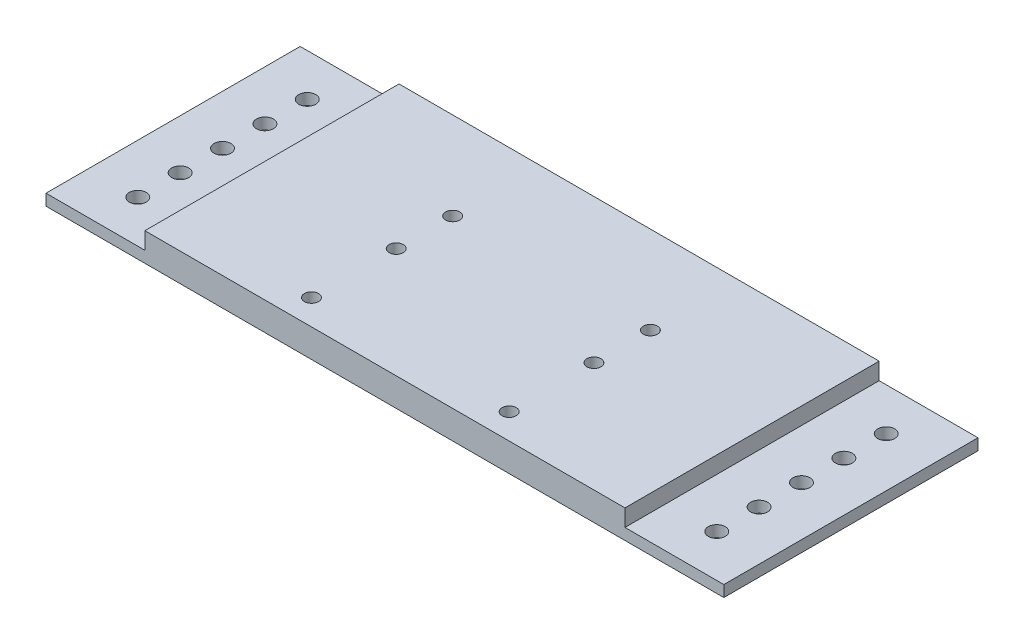
ISO-10303-21;
HEADER;
FILE_DESCRIPTION(('STEP AP214'),'2;1');
FILE_NAME('part.step','',(''),(''),'','','');
FILE_SCHEMA(('AUTOMOTIVE_DESIGN { 1 0 10303 214 1 1 1 1 }'));
ENDSEC;
DATA;
#1=APPLICATION_CONTEXT('core data for automotive mechanical design processes');
#2=APPLICATION_PROTOCOL_DEFINITION('international standard','automotive_design',2000,#1);
#3=PRODUCT_CONTEXT('',#1,'mechanical');
#4=PRODUCT('Part','Part','',(#3));
#5=PRODUCT_RELATED_PRODUCT_CATEGORY('part','',(#4));
#6=PRODUCT_DEFINITION_FORMATION('','',#4);
#7=PRODUCT_DEFINITION_CONTEXT('part definition',#1,'design');
#8=PRODUCT_DEFINITION('design','',#6,#7);
#9=PRODUCT_DEFINITION_SHAPE('','',#8);
#10=(LENGTH_UNIT() NAMED_UNIT(*) SI_UNIT(.MILLI.,.METRE.));
#11=(NAMED_UNIT(*) PLANE_ANGLE_UNIT() SI_UNIT($,.RADIAN.));
#12=(NAMED_UNIT(*) SI_UNIT($,.STERADIAN.) SOLID_ANGLE_UNIT());
#13=UNCERTAINTY_MEASURE_WITH_UNIT(LENGTH_MEASURE(1.E-05),#10,'distance_accuracy_value','');
#14=(GEOMETRIC_REPRESENTATION_CONTEXT(3) GLOBAL_UNCERTAINTY_ASSIGNED_CONTEXT((#13)) GLOBAL_UNIT_ASSIGNED_CONTEXT((#10,
#11,#12)) REPRESENTATION_CONTEXT('',''));
#15=CARTESIAN_POINT('',(0.,0.,0.));
#16=DIRECTION('',(0.,0.,1.));
#17=DIRECTION('',(1.,0.,0.));
#18=AXIS2_PLACEMENT_3D('',#15,#16,#17);
#19=CARTESIAN_POINT('',(0.,4.,0.));
#20=DIRECTION('',(0.,1.,0.));
#21=DIRECTION('',(0.,0.,1.));
#22=AXIS2_PLACEMENT_3D('',#19,#20,#21);
#23=PLANE('',#22);
#24=CARTESIAN_POINT('',(222.5,4.,14.9999999999999));
#25=DIRECTION('',(0.,1.,0.));
#26=DIRECTION('',(0.,0.,-1.));
#27=AXIS2_PLACEMENT_3D('',#24,#25,#26);
#28=CIRCLE('',#27,3.00000000000002);
#29=CARTESIAN_POINT('',(222.5,4.,11.9999999999999));
#30=VERTEX_POINT('',#29);
#31=EDGE_CURVE('E235',#30,#30,#28,.T.);
#32=ORIENTED_EDGE('',*,*,#31,.F.);
#33=EDGE_LOOP('',(#32));
#34=FACE_BOUND('',#33,.T.);
#35=CARTESIAN_POINT('',(222.5,4.,29.9999999999999));
#36=DIRECTION('',(0.,1.,0.));
#37=DIRECTION('',(0.,0.,-1.));
#38=AXIS2_PLACEMENT_3D('',#35,#36,#37);
#39=CIRCLE('',#38,3.00000000000002);
#40=CARTESIAN_POINT('',(222.5,4.,26.9999999999999));
#41=VERTEX_POINT('',#40);
#42=EDGE_CURVE('E242',#41,#41,#39,.T.);
#43=ORIENTED_EDGE('',*,*,#42,.F.);
#44=EDGE_LOOP('',(#43));
#45=FACE_BOUND('',#44,.T.);
#46=CARTESIAN_POINT('',(222.5,4.,44.9999999999999));
#47=DIRECTION('',(0.,1.,0.));
#48=DIRECTION('',(0.,0.,-1.));
#49=AXIS2_PLACEMENT_3D('',#46,#47,#48);
#50=CIRCLE('',#49,2.99999999999999);
#51=CARTESIAN_POINT('',(222.5,4.,41.9999999999999));
#52=VERTEX_POINT('',#51);
#53=EDGE_CURVE('E248',#52,#52,#50,.T.);
#54=ORIENTED_EDGE('',*,*,#53,.F.);
#55=EDGE_LOOP('',(#54));
#56=FACE_BOUND('',#55,.T.);
#57=CARTESIAN_POINT('',(222.5,4.,59.9999999999999));
#58=DIRECTION('',(0.,1.,0.));
#59=DIRECTION('',(0.,0.,-1.));
#60=AXIS2_PLACEMENT_3D('',#57,#58,#59);
#61=CIRCLE('',#60,2.99999999999999);
#62=CARTESIAN_POINT('',(222.5,4.,56.9999999999999));
#63=VERTEX_POINT('',#62);
#64=EDGE_CURVE('E254',#63,#63,#61,.T.);
#65=ORIENTED_EDGE('',*,*,#64,.F.);
#66=EDGE_LOOP('',(#65));
#67=FACE_BOUND('',#66,.T.);
#68=CARTESIAN_POINT('',(222.5,4.,74.9999999999999));
#69=DIRECTION('',(0.,1.,0.));
#70=DIRECTION('',(0.,0.,-1.));
#71=AXIS2_PLACEMENT_3D('',#68,#69,#70);
#72=CIRCLE('',#71,2.99999999999999);
#73=CARTESIAN_POINT('',(222.5,4.,71.9999999999999));
#74=VERTEX_POINT('',#73);
#75=EDGE_CURVE('E260',#74,#74,#72,.T.);
#76=ORIENTED_EDGE('',*,*,#75,.F.);
#77=EDGE_LOOP('',(#76));
#78=FACE_BOUND('',#77,.T.);
#79=DIRECTION('',(0.,0.,-1.));
#80=VECTOR('',#79,1.);
#81=CARTESIAN_POINT('',(205.,4.,0.));
#82=LINE('',#81,#80);
#83=CARTESIAN_POINT('',(205.,4.,90.));
#84=VERTEX_POINT('',#83);
#85=CARTESIAN_POINT('',(205.,4.,0.));
#86=VERTEX_POINT('',#85);
#87=EDGE_CURVE('E126',#84,#86,#82,.T.);
#88=ORIENTED_EDGE('',*,*,#87,.F.);
#89=DIRECTION('',(1.,0.,0.));
#90=VECTOR('',#89,1.);
#91=CARTESIAN_POINT('',(0.,4.,90.));
#92=LINE('',#91,#90);
#93=CARTESIAN_POINT('',(240.,4.,90.));
#94=VERTEX_POINT('',#93);
#95=EDGE_CURVE('E139',#84,#94,#92,.T.);
#96=ORIENTED_EDGE('',*,*,#95,.T.);
#97=DIRECTION('',(0.,0.,-1.));
#98=VECTOR('',#97,1.);
#99=CARTESIAN_POINT('',(240.,4.,0.));
#100=LINE('',#99,#98);
#101=CARTESIAN_POINT('',(240.,4.,0.));
#102=VERTEX_POINT('',#101);
#103=EDGE_CURVE('E143',#94,#102,#100,.T.);
#104=ORIENTED_EDGE('',*,*,#103,.T.);
#105=DIRECTION('',(-1.,0.,0.));
#106=VECTOR('',#105,1.);
#107=CARTESIAN_POINT('',(0.,4.,0.));
#108=LINE('',#107,#106);
#109=EDGE_CURVE('E63',#102,#86,#108,.T.);
#110=ORIENTED_EDGE('',*,*,#109,.T.);
#111=EDGE_LOOP('',(#88,#96,#104,#110));
#112=FACE_BOUND('',#111,.T.);
#113=ADVANCED_FACE('F40',(#34,#45,#56,#67,#78,#112),#23,.T.);
#114=CARTESIAN_POINT('',(0.,4.,0.));
#115=DIRECTION('',(1.,0.,0.));
#116=DIRECTION('',(0.,0.,-1.));
#117=AXIS2_PLACEMENT_3D('',#114,#115,#116);
#118=PLANE('',#117);
#119=DIRECTION('',(0.,0.,1.));
#120=VECTOR('',#119,1.);
#121=CARTESIAN_POINT('',(0.,0.,0.));
#122=LINE('',#121,#120);
#123=CARTESIAN_POINT('',(0.,0.,0.));
#124=VERTEX_POINT('',#123);
#125=CARTESIAN_POINT('',(0.,0.,90.));
#126=VERTEX_POINT('',#125);
#127=EDGE_CURVE('E127',#124,#126,#122,.T.);
#128=ORIENTED_EDGE('',*,*,#127,.T.);
#129=DIRECTION('',(0.,-1.,0.));
#130=VECTOR('',#129,1.);
#131=CARTESIAN_POINT('',(0.,4.,90.));
#132=LINE('',#131,#130);
#133=CARTESIAN_POINT('',(0.,4.,90.));
#134=VERTEX_POINT('',#133);
#135=EDGE_CURVE('E11',#134,#126,#132,.T.);
#136=ORIENTED_EDGE('',*,*,#135,.F.);
#137=DIRECTION('',(0.,0.,1.));
#138=VECTOR('',#137,1.);
#139=CARTESIAN_POINT('',(0.,4.,0.));
#140=LINE('',#139,#138);
#141=CARTESIAN_POINT('',(0.,4.,0.));
#142=VERTEX_POINT('',#141);
#143=EDGE_CURVE('E136',#142,#134,#140,.T.);
#144=ORIENTED_EDGE('',*,*,#143,.F.);
#145=DIRECTION('',(0.,-1.,0.));
#146=VECTOR('',#145,1.);
#147=CARTESIAN_POINT('',(0.,4.,0.));
#148=LINE('',#147,#146);
#149=EDGE_CURVE('E146',#142,#124,#148,.T.);
#150=ORIENTED_EDGE('',*,*,#149,.T.);
#151=EDGE_LOOP('',(#128,#136,#144,#150));
#152=FACE_BOUND('',#151,.T.);
#153=ADVANCED_FACE('F42',(#152),#118,.F.);
#154=CARTESIAN_POINT('',(0.,4.,90.));
#155=DIRECTION('',(0.,0.,-1.));
#156=DIRECTION('',(-1.,0.,0.));
#157=AXIS2_PLACEMENT_3D('',#154,#155,#156);
#158=PLANE('',#157);
#159=DIRECTION('',(1.,0.,0.));
#160=VECTOR('',#159,1.);
#161=CARTESIAN_POINT('',(0.,0.,90.));
#162=LINE('',#161,#160);
#163=CARTESIAN_POINT('',(240.,0.,90.));
#164=VERTEX_POINT('',#163);
#165=EDGE_CURVE('E130',#126,#164,#162,.T.);
#166=ORIENTED_EDGE('',*,*,#165,.T.);
#167=DIRECTION('',(0.,-1.,0.));
#168=VECTOR('',#167,1.);
#169=CARTESIAN_POINT('',(240.,4.,90.));
#170=LINE('',#169,#168);
#171=EDGE_CURVE('E48',#94,#164,#170,.T.);
#172=ORIENTED_EDGE('',*,*,#171,.F.);
#173=ORIENTED_EDGE('',*,*,#95,.F.);
#174=DIRECTION('',(0.,-1.,0.));
#175=VECTOR('',#174,1.);
#176=CARTESIAN_POINT('',(205.,10.,90.));
#177=LINE('',#176,#175);
#178=CARTESIAN_POINT('',(205.,10.,90.));
#179=VERTEX_POINT('',#178);
#180=EDGE_CURVE('E179',#179,#84,#177,.T.);
#181=ORIENTED_EDGE('',*,*,#180,.F.);
#182=DIRECTION('',(1.,0.,0.));
#183=VECTOR('',#182,1.);
#184=CARTESIAN_POINT('',(35.,10.,90.));
#185=LINE('',#184,#183);
#186=CARTESIAN_POINT('',(35.,10.,90.));
#187=VERTEX_POINT('',#186);
#188=EDGE_CURVE('E120',#187,#179,#185,.T.);
#189=ORIENTED_EDGE('',*,*,#188,.F.);
#190=DIRECTION('',(0.,-1.,0.));
#191=VECTOR('',#190,1.);
#192=CARTESIAN_POINT('',(35.,10.,90.));
#193=LINE('',#192,#191);
#194=CARTESIAN_POINT('',(35.,4.,90.));
#195=VERTEX_POINT('',#194);
#196=EDGE_CURVE('E132',#187,#195,#193,.T.);
#197=ORIENTED_EDGE('',*,*,#196,.T.);
#198=EDGE_CURVE('E141',#134,#195,#92,.T.);
#199=ORIENTED_EDGE('',*,*,#198,.F.);
#200=ORIENTED_EDGE('',*,*,#135,.T.);
#201=EDGE_LOOP('',(#166,#172,#173,#181,#189,#197,#199,#200));
#202=FACE_BOUND('',#201,.T.);
#203=ADVANCED_FACE('F185',(#202),#158,.F.);
#204=CARTESIAN_POINT('',(240.,4.,0.));
#205=DIRECTION('',(-1.,0.,0.));
#206=DIRECTION('',(0.,0.,1.));
#207=AXIS2_PLACEMENT_3D('',#204,#205,#206);
#208=PLANE('',#207);
#209=DIRECTION('',(0.,0.,-1.));
#210=VECTOR('',#209,1.);
#211=CARTESIAN_POINT('',(240.,0.,0.));
#212=LINE('',#211,#210);
#213=CARTESIAN_POINT('',(240.,0.,0.));
#214=VERTEX_POINT('',#213);
#215=EDGE_CURVE('E149',#164,#214,#212,.T.);
#216=ORIENTED_EDGE('',*,*,#215,.T.);
#217=DIRECTION('',(0.,-1.,0.));
#218=VECTOR('',#217,1.);
#219=CARTESIAN_POINT('',(240.,4.,0.));
#220=LINE('',#219,#218);
#221=EDGE_CURVE('E154',#102,#214,#220,.T.);
#222=ORIENTED_EDGE('',*,*,#221,.F.);
#223=ORIENTED_EDGE('',*,*,#103,.F.);
#224=ORIENTED_EDGE('',*,*,#171,.T.);
#225=EDGE_LOOP('',(#216,#222,#223,#224));
#226=FACE_BOUND('',#225,.T.);
#227=ADVANCED_FACE('F161',(#226),#208,.F.);
#228=CARTESIAN_POINT('',(0.,4.,0.));
#229=DIRECTION('',(0.,0.,1.));
#230=DIRECTION('',(1.,0.,0.));
#231=AXIS2_PLACEMENT_3D('',#228,#229,#230);
#232=PLANE('',#231);
#233=DIRECTION('',(-1.,0.,0.));
#234=VECTOR('',#233,1.);
#235=CARTESIAN_POINT('',(0.,0.,0.));
#236=LINE('',#235,#234);
#237=EDGE_CURVE('E140',#214,#124,#236,.T.);
#238=ORIENTED_EDGE('',*,*,#237,.T.);
#239=ORIENTED_EDGE('',*,*,#149,.F.);
#240=CARTESIAN_POINT('',(35.,4.,0.));
#241=VERTEX_POINT('',#240);
#242=EDGE_CURVE('E145',#241,#142,#108,.T.);
#243=ORIENTED_EDGE('',*,*,#242,.F.);
#244=DIRECTION('',(0.,-1.,0.));
#245=VECTOR('',#244,1.);
#246=CARTESIAN_POINT('',(35.,10.,0.));
#247=LINE('',#246,#245);
#248=CARTESIAN_POINT('',(35.,10.,0.));
#249=VERTEX_POINT('',#248);
#250=EDGE_CURVE('E111',#249,#241,#247,.T.);
#251=ORIENTED_EDGE('',*,*,#250,.F.);
#252=DIRECTION('',(-1.,0.,0.));
#253=VECTOR('',#252,1.);
#254=CARTESIAN_POINT('',(35.,10.,0.));
#255=LINE('',#254,#253);
#256=CARTESIAN_POINT('',(205.,10.,0.));
#257=VERTEX_POINT('',#256);
#258=EDGE_CURVE('E104',#257,#249,#255,.T.);
#259=ORIENTED_EDGE('',*,*,#258,.F.);
#260=DIRECTION('',(0.,-1.,0.));
#261=VECTOR('',#260,1.);
#262=CARTESIAN_POINT('',(205.,10.,0.));
#263=LINE('',#262,#261);
#264=EDGE_CURVE('E108',#257,#86,#263,.T.);
#265=ORIENTED_EDGE('',*,*,#264,.T.);
#266=ORIENTED_EDGE('',*,*,#109,.F.);
#267=ORIENTED_EDGE('',*,*,#221,.T.);
#268=EDGE_LOOP('',(#238,#239,#243,#251,#259,#265,#266,#267));
#269=FACE_BOUND('',#268,.T.);
#270=ADVANCED_FACE('F106',(#269),#232,.F.);
#271=CARTESIAN_POINT('',(17.5,4.,75.));
#272=DIRECTION('',(0.,1.,0.));
#273=DIRECTION('',(0.,0.,1.));
#274=AXIS2_PLACEMENT_3D('',#271,#272,#273);
#275=CIRCLE('',#274,3.);
#276=CARTESIAN_POINT('',(17.5,4.,78.));
#277=VERTEX_POINT('',#276);
#278=EDGE_CURVE('E209',#277,#277,#275,.T.);
#279=ORIENTED_EDGE('',*,*,#278,.F.);
#280=EDGE_LOOP('',(#279));
#281=FACE_BOUND('',#280,.T.);
#282=CARTESIAN_POINT('',(17.5,4.,60.));
#283=DIRECTION('',(0.,1.,0.));
#284=DIRECTION('',(0.,0.,1.));
#285=AXIS2_PLACEMENT_3D('',#282,#283,#284);
#286=CIRCLE('',#285,3.);
#287=CARTESIAN_POINT('',(17.5,4.,63.));
#288=VERTEX_POINT('',#287);
#289=EDGE_CURVE('E213',#288,#288,#286,.T.);
#290=ORIENTED_EDGE('',*,*,#289,.F.);
#291=EDGE_LOOP('',(#290));
#292=FACE_BOUND('',#291,.T.);
#293=CARTESIAN_POINT('',(17.5,4.,45.));
#294=DIRECTION('',(0.,1.,0.));
#295=DIRECTION('',(0.,0.,1.));
#296=AXIS2_PLACEMENT_3D('',#293,#294,#295);
#297=CIRCLE('',#296,3.);
#298=CARTESIAN_POINT('',(17.5,4.,48.));
#299=VERTEX_POINT('',#298);
#300=EDGE_CURVE('E217',#299,#299,#297,.T.);
#301=ORIENTED_EDGE('',*,*,#300,.F.);
#302=EDGE_LOOP('',(#301));
#303=FACE_BOUND('',#302,.T.);
#304=CARTESIAN_POINT('',(17.5,4.,30.));
#305=DIRECTION('',(0.,1.,0.));
#306=DIRECTION('',(0.,0.,1.));
#307=AXIS2_PLACEMENT_3D('',#304,#305,#306);
#308=CIRCLE('',#307,3.);
#309=CARTESIAN_POINT('',(17.5,4.,33.));
#310=VERTEX_POINT('',#309);
#311=EDGE_CURVE('E221',#310,#310,#308,.T.);
#312=ORIENTED_EDGE('',*,*,#311,.F.);
#313=EDGE_LOOP('',(#312));
#314=FACE_BOUND('',#313,.T.);
#315=CARTESIAN_POINT('',(17.5,4.,15.));
#316=DIRECTION('',(0.,1.,0.));
#317=DIRECTION('',(0.,0.,1.));
#318=AXIS2_PLACEMENT_3D('',#315,#316,#317);
#319=CIRCLE('',#318,3.);
#320=CARTESIAN_POINT('',(17.5,4.,18.));
#321=VERTEX_POINT('',#320);
#322=EDGE_CURVE('E224',#321,#321,#319,.T.);
#323=ORIENTED_EDGE('',*,*,#322,.F.);
#324=EDGE_LOOP('',(#323));
#325=FACE_BOUND('',#324,.T.);
#326=DIRECTION('',(0.,0.,1.));
#327=VECTOR('',#326,1.);
#328=CARTESIAN_POINT('',(35.,4.,0.));
#329=LINE('',#328,#327);
#330=EDGE_CURVE('E55',#241,#195,#329,.T.);
#331=ORIENTED_EDGE('',*,*,#330,.F.);
#332=ORIENTED_EDGE('',*,*,#242,.T.);
#333=ORIENTED_EDGE('',*,*,#143,.T.);
#334=ORIENTED_EDGE('',*,*,#198,.T.);
#335=EDGE_LOOP('',(#331,#332,#333,#334));
#336=FACE_BOUND('',#335,.T.);
#337=ADVANCED_FACE('F173',(#281,#292,#303,#314,#325,#336),#23,.T.);
#338=CARTESIAN_POINT('',(0.,0.,0.));
#339=DIRECTION('',(0.,1.,0.));
#340=DIRECTION('',(0.,0.,1.));
#341=AXIS2_PLACEMENT_3D('',#338,#339,#340);
#342=PLANE('',#341);
#343=CARTESIAN_POINT('',(85.,0.,51.));
#344=DIRECTION('',(0.,-1.,0.));
#345=DIRECTION('',(0.,0.,-1.));
#346=AXIS2_PLACEMENT_3D('',#343,#344,#345);
#347=CIRCLE('',#346,2.5);
#348=CARTESIAN_POINT('',(85.,0.,48.5));
#349=VERTEX_POINT('',#348);
#350=EDGE_CURVE('E298',#349,#349,#347,.T.);
#351=ORIENTED_EDGE('',*,*,#350,.F.);
#352=EDGE_LOOP('',(#351));
#353=FACE_BOUND('',#352,.T.);
#354=CARTESIAN_POINT('',(155.,0.,31.));
#355=DIRECTION('',(0.,-1.,0.));
#356=DIRECTION('',(0.,0.,-1.));
#357=AXIS2_PLACEMENT_3D('',#354,#355,#356);
#358=CIRCLE('',#357,2.5);
#359=CARTESIAN_POINT('',(155.,0.,28.5));
#360=VERTEX_POINT('',#359);
#361=EDGE_CURVE('E287',#360,#360,#358,.T.);
#362=ORIENTED_EDGE('',*,*,#361,.F.);
#363=EDGE_LOOP('',(#362));
#364=FACE_BOUND('',#363,.T.);
#365=CARTESIAN_POINT('',(85.,0.,31.));
#366=DIRECTION('',(0.,-1.,0.));
#367=DIRECTION('',(0.,0.,-1.));
#368=AXIS2_PLACEMENT_3D('',#365,#366,#367);
#369=CIRCLE('',#368,2.49999999999999);
#370=CARTESIAN_POINT('',(85.,0.,28.5));
#371=VERTEX_POINT('',#370);
#372=EDGE_CURVE('E286',#371,#371,#369,.T.);
#373=ORIENTED_EDGE('',*,*,#372,.F.);
#374=EDGE_LOOP('',(#373));
#375=FACE_BOUND('',#374,.T.);
#376=CARTESIAN_POINT('',(155.,0.,81.));
#377=DIRECTION('',(0.,-1.,0.));
#378=DIRECTION('',(0.,0.,-1.));
#379=AXIS2_PLACEMENT_3D('',#376,#377,#378);
#380=CIRCLE('',#379,2.5);
#381=CARTESIAN_POINT('',(155.,0.,78.5));
#382=VERTEX_POINT('',#381);
#383=EDGE_CURVE('E280',#382,#382,#380,.T.);
#384=ORIENTED_EDGE('',*,*,#383,.F.);
#385=EDGE_LOOP('',(#384));
#386=FACE_BOUND('',#385,.T.);
#387=CARTESIAN_POINT('',(155.,0.,51.));
#388=DIRECTION('',(0.,-1.,0.));
#389=DIRECTION('',(0.,0.,-1.));
#390=AXIS2_PLACEMENT_3D('',#387,#388,#389);
#391=CIRCLE('',#390,2.5);
#392=CARTESIAN_POINT('',(155.,0.,48.5));
#393=VERTEX_POINT('',#392);
#394=EDGE_CURVE('E299',#393,#393,#391,.T.);
#395=ORIENTED_EDGE('',*,*,#394,.F.);
#396=EDGE_LOOP('',(#395));
#397=FACE_BOUND('',#396,.T.);
#398=CARTESIAN_POINT('',(85.,0.,81.));
#399=DIRECTION('',(0.,-1.,0.));
#400=DIRECTION('',(0.,0.,-1.));
#401=AXIS2_PLACEMENT_3D('',#398,#399,#400);
#402=CIRCLE('',#401,2.5);
#403=CARTESIAN_POINT('',(85.,0.,78.5));
#404=VERTEX_POINT('',#403);
#405=EDGE_CURVE('E277',#404,#404,#402,.T.);
#406=ORIENTED_EDGE('',*,*,#405,.F.);
#407=EDGE_LOOP('',(#406));
#408=FACE_BOUND('',#407,.T.);
#409=CARTESIAN_POINT('',(222.5,0.,14.9999999999999));
#410=DIRECTION('',(0.,1.,0.));
#411=DIRECTION('',(0.,0.,-1.));
#412=AXIS2_PLACEMENT_3D('',#409,#410,#411);
#413=CIRCLE('',#412,3.00000000000002);
#414=CARTESIAN_POINT('',(222.5,0.,11.9999999999999));
#415=VERTEX_POINT('',#414);
#416=EDGE_CURVE('E232',#415,#415,#413,.T.);
#417=ORIENTED_EDGE('',*,*,#416,.T.);
#418=EDGE_LOOP('',(#417));
#419=FACE_BOUND('',#418,.T.);
#420=CARTESIAN_POINT('',(222.5,0.,29.9999999999999));
#421=DIRECTION('',(0.,1.,0.));
#422=DIRECTION('',(0.,0.,-1.));
#423=AXIS2_PLACEMENT_3D('',#420,#421,#422);
#424=CIRCLE('',#423,3.00000000000002);
#425=CARTESIAN_POINT('',(222.5,0.,26.9999999999999));
#426=VERTEX_POINT('',#425);
#427=EDGE_CURVE('E239',#426,#426,#424,.T.);
#428=ORIENTED_EDGE('',*,*,#427,.T.);
#429=EDGE_LOOP('',(#428));
#430=FACE_BOUND('',#429,.T.);
#431=CARTESIAN_POINT('',(222.5,0.,44.9999999999999));
#432=DIRECTION('',(0.,1.,0.));
#433=DIRECTION('',(0.,0.,-1.));
#434=AXIS2_PLACEMENT_3D('',#431,#432,#433);
#435=CIRCLE('',#434,2.99999999999999);
#436=CARTESIAN_POINT('',(222.5,0.,41.9999999999999));
#437=VERTEX_POINT('',#436);
#438=EDGE_CURVE('E245',#437,#437,#435,.T.);
#439=ORIENTED_EDGE('',*,*,#438,.T.);
#440=EDGE_LOOP('',(#439));
#441=FACE_BOUND('',#440,.T.);
#442=CARTESIAN_POINT('',(222.5,0.,59.9999999999999));
#443=DIRECTION('',(0.,1.,0.));
#444=DIRECTION('',(0.,0.,-1.));
#445=AXIS2_PLACEMENT_3D('',#442,#443,#444);
#446=CIRCLE('',#445,2.99999999999999);
#447=CARTESIAN_POINT('',(222.5,0.,56.9999999999999));
#448=VERTEX_POINT('',#447);
#449=EDGE_CURVE('E251',#448,#448,#446,.T.);
#450=ORIENTED_EDGE('',*,*,#449,.T.);
#451=EDGE_LOOP('',(#450));
#452=FACE_BOUND('',#451,.T.);
#453=CARTESIAN_POINT('',(222.5,0.,74.9999999999999));
#454=DIRECTION('',(0.,1.,0.));
#455=DIRECTION('',(0.,0.,-1.));
#456=AXIS2_PLACEMENT_3D('',#453,#454,#455);
#457=CIRCLE('',#456,2.99999999999999);
#458=CARTESIAN_POINT('',(222.5,0.,71.9999999999999));
#459=VERTEX_POINT('',#458);
#460=EDGE_CURVE('E257',#459,#459,#457,.T.);
#461=ORIENTED_EDGE('',*,*,#460,.T.);
#462=EDGE_LOOP('',(#461));
#463=FACE_BOUND('',#462,.T.);
#464=CARTESIAN_POINT('',(17.5,0.,75.));
#465=DIRECTION('',(0.,1.,0.));
#466=DIRECTION('',(0.,0.,1.));
#467=AXIS2_PLACEMENT_3D('',#464,#465,#466);
#468=CIRCLE('',#467,3.);
#469=CARTESIAN_POINT('',(17.5,0.,78.));
#470=VERTEX_POINT('',#469);
#471=EDGE_CURVE('E263',#470,#470,#468,.T.);
#472=ORIENTED_EDGE('',*,*,#471,.T.);
#473=EDGE_LOOP('',(#472));
#474=FACE_BOUND('',#473,.T.);
#475=CARTESIAN_POINT('',(17.5,0.,60.));
#476=DIRECTION('',(0.,1.,0.));
#477=DIRECTION('',(0.,0.,1.));
#478=AXIS2_PLACEMENT_3D('',#475,#476,#477);
#479=CIRCLE('',#478,3.);
#480=CARTESIAN_POINT('',(17.5,0.,63.));
#481=VERTEX_POINT('',#480);
#482=EDGE_CURVE('E267',#481,#481,#479,.T.);
#483=ORIENTED_EDGE('',*,*,#482,.T.);
#484=EDGE_LOOP('',(#483));
#485=FACE_BOUND('',#484,.T.);
#486=CARTESIAN_POINT('',(17.5,0.,45.));
#487=DIRECTION('',(0.,1.,0.));
#488=DIRECTION('',(0.,0.,1.));
#489=AXIS2_PLACEMENT_3D('',#486,#487,#488);
#490=CIRCLE('',#489,3.);
#491=CARTESIAN_POINT('',(17.5,0.,48.));
#492=VERTEX_POINT('',#491);
#493=EDGE_CURVE('E271',#492,#492,#490,.T.);
#494=ORIENTED_EDGE('',*,*,#493,.T.);
#495=EDGE_LOOP('',(#494));
#496=FACE_BOUND('',#495,.T.);
#497=CARTESIAN_POINT('',(17.5,0.,30.));
#498=DIRECTION('',(0.,1.,0.));
#499=DIRECTION('',(0.,0.,1.));
#500=AXIS2_PLACEMENT_3D('',#497,#498,#499);
#501=CIRCLE('',#500,3.);
#502=CARTESIAN_POINT('',(17.5,0.,33.));
#503=VERTEX_POINT('',#502);
#504=EDGE_CURVE('E229',#503,#503,#501,.T.);
#505=ORIENTED_EDGE('',*,*,#504,.T.);
#506=EDGE_LOOP('',(#505));
#507=FACE_BOUND('',#506,.T.);
#508=CARTESIAN_POINT('',(17.5,0.,15.));
#509=DIRECTION('',(0.,1.,0.));
#510=DIRECTION('',(0.,0.,1.));
#511=AXIS2_PLACEMENT_3D('',#508,#509,#510);
#512=CIRCLE('',#511,3.);
#513=CARTESIAN_POINT('',(17.5,0.,18.));
#514=VERTEX_POINT('',#513);
#515=EDGE_CURVE('E183',#514,#514,#512,.T.);
#516=ORIENTED_EDGE('',*,*,#515,.T.);
#517=EDGE_LOOP('',(#516));
#518=FACE_BOUND('',#517,.T.);
#519=ORIENTED_EDGE('',*,*,#127,.F.);
#520=ORIENTED_EDGE('',*,*,#237,.F.);
#521=ORIENTED_EDGE('',*,*,#215,.F.);
#522=ORIENTED_EDGE('',*,*,#165,.F.);
#523=EDGE_LOOP('',(#519,#520,#521,#522));
#524=FACE_BOUND('',#523,.T.);
#525=ADVANCED_FACE('F168',(#353,#364,#375,#386,#397,#408,#419,#430,#441,#452,#463,#474,#485,
#496,#507,#518,#524),#342,.F.);
#526=CARTESIAN_POINT('',(205.,10.,0.));
#527=DIRECTION('',(-1.,0.,0.));
#528=DIRECTION('',(0.,0.,1.));
#529=AXIS2_PLACEMENT_3D('',#526,#527,#528);
#530=PLANE('',#529);
#531=ORIENTED_EDGE('',*,*,#87,.T.);
#532=ORIENTED_EDGE('',*,*,#264,.F.);
#533=DIRECTION('',(0.,0.,-1.));
#534=VECTOR('',#533,1.);
#535=CARTESIAN_POINT('',(205.,10.,0.));
#536=LINE('',#535,#534);
#537=EDGE_CURVE('E115',#179,#257,#536,.T.);
#538=ORIENTED_EDGE('',*,*,#537,.F.);
#539=ORIENTED_EDGE('',*,*,#180,.T.);
#540=EDGE_LOOP('',(#531,#532,#538,#539));
#541=FACE_BOUND('',#540,.T.);
#542=ADVANCED_FACE('F125',(#541),#530,.F.);
#543=CARTESIAN_POINT('',(35.,10.,0.));
#544=DIRECTION('',(1.,0.,0.));
#545=DIRECTION('',(0.,0.,-1.));
#546=AXIS2_PLACEMENT_3D('',#543,#544,#545);
#547=PLANE('',#546);
#548=ORIENTED_EDGE('',*,*,#330,.T.);
#549=ORIENTED_EDGE('',*,*,#196,.F.);
#550=DIRECTION('',(0.,0.,1.));
#551=VECTOR('',#550,1.);
#552=CARTESIAN_POINT('',(35.,10.,0.));
#553=LINE('',#552,#551);
#554=EDGE_CURVE('E114',#249,#187,#553,.T.);
#555=ORIENTED_EDGE('',*,*,#554,.F.);
#556=ORIENTED_EDGE('',*,*,#250,.T.);
#557=EDGE_LOOP('',(#548,#549,#555,#556));
#558=FACE_BOUND('',#557,.T.);
#559=ADVANCED_FACE('F175',(#558),#547,.F.);
#560=CARTESIAN_POINT('',(0.,10.,0.));
#561=DIRECTION('',(0.,1.,0.));
#562=DIRECTION('',(0.,0.,1.));
#563=AXIS2_PLACEMENT_3D('',#560,#561,#562);
#564=PLANE('',#563);
#565=CARTESIAN_POINT('',(85.,10.,51.));
#566=DIRECTION('',(0.,-1.,0.));
#567=DIRECTION('',(0.,0.,-1.));
#568=AXIS2_PLACEMENT_3D('',#565,#566,#567);
#569=CIRCLE('',#568,2.5);
#570=CARTESIAN_POINT('',(85.,10.,48.5));
#571=VERTEX_POINT('',#570);
#572=EDGE_CURVE('E295',#571,#571,#569,.T.);
#573=ORIENTED_EDGE('',*,*,#572,.T.);
#574=EDGE_LOOP('',(#573));
#575=FACE_BOUND('',#574,.T.);
#576=CARTESIAN_POINT('',(155.,10.,31.));
#577=DIRECTION('',(0.,-1.,0.));
#578=DIRECTION('',(0.,0.,-1.));
#579=AXIS2_PLACEMENT_3D('',#576,#577,#578);
#580=CIRCLE('',#579,2.5);
#581=CARTESIAN_POINT('',(155.,10.,28.5));
#582=VERTEX_POINT('',#581);
#583=EDGE_CURVE('E302',#582,#582,#580,.T.);
#584=ORIENTED_EDGE('',*,*,#583,.T.);
#585=EDGE_LOOP('',(#584));
#586=FACE_BOUND('',#585,.T.);
#587=CARTESIAN_POINT('',(85.,10.,31.));
#588=DIRECTION('',(0.,-1.,0.));
#589=DIRECTION('',(0.,0.,-1.));
#590=AXIS2_PLACEMENT_3D('',#587,#588,#589);
#591=CIRCLE('',#590,2.49999999999999);
#592=CARTESIAN_POINT('',(85.,10.,28.5));
#593=VERTEX_POINT('',#592);
#594=EDGE_CURVE('E283',#593,#593,#591,.T.);
#595=ORIENTED_EDGE('',*,*,#594,.T.);
#596=EDGE_LOOP('',(#595));
#597=FACE_BOUND('',#596,.T.);
#598=CARTESIAN_POINT('',(155.,10.,81.));
#599=DIRECTION('',(0.,-1.,0.));
#600=DIRECTION('',(0.,0.,-1.));
#601=AXIS2_PLACEMENT_3D('',#598,#599,#600);
#602=CIRCLE('',#601,2.5);
#603=CARTESIAN_POINT('',(155.,10.,78.5));
#604=VERTEX_POINT('',#603);
#605=EDGE_CURVE('E290',#604,#604,#602,.T.);
#606=ORIENTED_EDGE('',*,*,#605,.T.);
#607=EDGE_LOOP('',(#606));
#608=FACE_BOUND('',#607,.T.);
#609=CARTESIAN_POINT('',(155.,10.,51.));
#610=DIRECTION('',(0.,-1.,0.));
#611=DIRECTION('',(0.,0.,-1.));
#612=AXIS2_PLACEMENT_3D('',#609,#610,#611);
#613=CIRCLE('',#612,2.5);
#614=CARTESIAN_POINT('',(155.,10.,48.5));
#615=VERTEX_POINT('',#614);
#616=EDGE_CURVE('E307',#615,#615,#613,.T.);
#617=ORIENTED_EDGE('',*,*,#616,.T.);
#618=EDGE_LOOP('',(#617));
#619=FACE_BOUND('',#618,.T.);
#620=CARTESIAN_POINT('',(85.,10.,81.));
#621=DIRECTION('',(0.,-1.,0.));
#622=DIRECTION('',(0.,0.,-1.));
#623=AXIS2_PLACEMENT_3D('',#620,#621,#622);
#624=CIRCLE('',#623,2.5);
#625=CARTESIAN_POINT('',(85.,10.,78.5));
#626=VERTEX_POINT('',#625);
#627=EDGE_CURVE('E236',#626,#626,#624,.T.);
#628=ORIENTED_EDGE('',*,*,#627,.T.);
#629=EDGE_LOOP('',(#628));
#630=FACE_BOUND('',#629,.T.);
#631=ORIENTED_EDGE('',*,*,#537,.T.);
#632=ORIENTED_EDGE('',*,*,#258,.T.);
#633=ORIENTED_EDGE('',*,*,#554,.T.);
#634=ORIENTED_EDGE('',*,*,#188,.T.);
#635=EDGE_LOOP('',(#631,#632,#633,#634));
#636=FACE_BOUND('',#635,.T.);
#637=ADVANCED_FACE('F118',(#575,#586,#597,#608,#619,#630,#636),#564,.T.);
#638=CARTESIAN_POINT('',(17.5,0.,15.));
#639=DIRECTION('',(0.,1.,0.));
#640=DIRECTION('',(0.,0.,1.));
#641=AXIS2_PLACEMENT_3D('',#638,#639,#640);
#642=CYLINDRICAL_SURFACE('',#641,3.);
#643=ORIENTED_EDGE('',*,*,#515,.F.);
#644=EDGE_LOOP('',(#643));
#645=FACE_BOUND('',#644,.T.);
#646=ORIENTED_EDGE('',*,*,#322,.T.);
#647=EDGE_LOOP('',(#646));
#648=FACE_BOUND('',#647,.T.);
#649=ADVANCED_FACE('F338',(#645,#648),#642,.F.);
#650=CARTESIAN_POINT('',(17.5,0.,30.));
#651=DIRECTION('',(0.,1.,0.));
#652=DIRECTION('',(0.,0.,1.));
#653=AXIS2_PLACEMENT_3D('',#650,#651,#652);
#654=CYLINDRICAL_SURFACE('',#653,3.);
#655=ORIENTED_EDGE('',*,*,#504,.F.);
#656=EDGE_LOOP('',(#655));
#657=FACE_BOUND('',#656,.T.);
#658=ORIENTED_EDGE('',*,*,#311,.T.);
#659=EDGE_LOOP('',(#658));
#660=FACE_BOUND('',#659,.T.);
#661=ADVANCED_FACE('F339',(#657,#660),#654,.F.);
#662=CARTESIAN_POINT('',(17.5,0.,45.));
#663=DIRECTION('',(0.,1.,0.));
#664=DIRECTION('',(0.,0.,1.));
#665=AXIS2_PLACEMENT_3D('',#662,#663,#664);
#666=CYLINDRICAL_SURFACE('',#665,3.);
#667=ORIENTED_EDGE('',*,*,#493,.F.);
#668=EDGE_LOOP('',(#667));
#669=FACE_BOUND('',#668,.T.);
#670=ORIENTED_EDGE('',*,*,#300,.T.);
#671=EDGE_LOOP('',(#670));
#672=FACE_BOUND('',#671,.T.);
#673=ADVANCED_FACE('F344',(#669,#672),#666,.F.);
#674=CARTESIAN_POINT('',(17.5,0.,60.));
#675=DIRECTION('',(0.,1.,0.));
#676=DIRECTION('',(0.,0.,1.));
#677=AXIS2_PLACEMENT_3D('',#674,#675,#676);
#678=CYLINDRICAL_SURFACE('',#677,3.);
#679=ORIENTED_EDGE('',*,*,#482,.F.);
#680=EDGE_LOOP('',(#679));
#681=FACE_BOUND('',#680,.T.);
#682=ORIENTED_EDGE('',*,*,#289,.T.);
#683=EDGE_LOOP('',(#682));
#684=FACE_BOUND('',#683,.T.);
#685=ADVANCED_FACE('F392',(#681,#684),#678,.F.);
#686=CARTESIAN_POINT('',(17.5,0.,75.));
#687=DIRECTION('',(0.,1.,0.));
#688=DIRECTION('',(0.,0.,1.));
#689=AXIS2_PLACEMENT_3D('',#686,#687,#688);
#690=CYLINDRICAL_SURFACE('',#689,3.);
#691=ORIENTED_EDGE('',*,*,#471,.F.);
#692=EDGE_LOOP('',(#691));
#693=FACE_BOUND('',#692,.T.);
#694=ORIENTED_EDGE('',*,*,#278,.T.);
#695=EDGE_LOOP('',(#694));
#696=FACE_BOUND('',#695,.T.);
#697=ADVANCED_FACE('F402',(#693,#696),#690,.F.);
#698=CARTESIAN_POINT('',(222.5,0.,74.9999999999999));
#699=DIRECTION('',(0.,1.,0.));
#700=DIRECTION('',(0.,0.,1.));
#701=AXIS2_PLACEMENT_3D('',#698,#699,#700);
#702=CYLINDRICAL_SURFACE('',#701,2.99999999999999);
#703=ORIENTED_EDGE('',*,*,#460,.F.);
#704=EDGE_LOOP('',(#703));
#705=FACE_BOUND('',#704,.T.);
#706=ORIENTED_EDGE('',*,*,#75,.T.);
#707=EDGE_LOOP('',(#706));
#708=FACE_BOUND('',#707,.T.);
#709=ADVANCED_FACE('F412',(#705,#708),#702,.F.);
#710=CARTESIAN_POINT('',(222.5,0.,59.9999999999999));
#711=DIRECTION('',(0.,1.,0.));
#712=DIRECTION('',(0.,0.,1.));
#713=AXIS2_PLACEMENT_3D('',#710,#711,#712);
#714=CYLINDRICAL_SURFACE('',#713,2.99999999999999);
#715=ORIENTED_EDGE('',*,*,#449,.F.);
#716=EDGE_LOOP('',(#715));
#717=FACE_BOUND('',#716,.T.);
#718=ORIENTED_EDGE('',*,*,#64,.T.);
#719=EDGE_LOOP('',(#718));
#720=FACE_BOUND('',#719,.T.);
#721=ADVANCED_FACE('F422',(#717,#720),#714,.F.);
#722=CARTESIAN_POINT('',(222.5,0.,44.9999999999999));
#723=DIRECTION('',(0.,1.,0.));
#724=DIRECTION('',(0.,0.,1.));
#725=AXIS2_PLACEMENT_3D('',#722,#723,#724);
#726=CYLINDRICAL_SURFACE('',#725,2.99999999999999);
#727=ORIENTED_EDGE('',*,*,#438,.F.);
#728=EDGE_LOOP('',(#727));
#729=FACE_BOUND('',#728,.T.);
#730=ORIENTED_EDGE('',*,*,#53,.T.);
#731=EDGE_LOOP('',(#730));
#732=FACE_BOUND('',#731,.T.);
#733=ADVANCED_FACE('F432',(#729,#732),#726,.F.);
#734=CARTESIAN_POINT('',(222.5,0.,29.9999999999999));
#735=DIRECTION('',(0.,1.,0.));
#736=DIRECTION('',(0.,0.,1.));
#737=AXIS2_PLACEMENT_3D('',#734,#735,#736);
#738=CYLINDRICAL_SURFACE('',#737,3.00000000000002);
#739=ORIENTED_EDGE('',*,*,#427,.F.);
#740=EDGE_LOOP('',(#739));
#741=FACE_BOUND('',#740,.T.);
#742=ORIENTED_EDGE('',*,*,#42,.T.);
#743=EDGE_LOOP('',(#742));
#744=FACE_BOUND('',#743,.T.);
#745=ADVANCED_FACE('F442',(#741,#744),#738,.F.);
#746=CARTESIAN_POINT('',(222.5,0.,14.9999999999999));
#747=DIRECTION('',(0.,1.,0.));
#748=DIRECTION('',(0.,0.,1.));
#749=AXIS2_PLACEMENT_3D('',#746,#747,#748);
#750=CYLINDRICAL_SURFACE('',#749,3.00000000000002);
#751=ORIENTED_EDGE('',*,*,#416,.F.);
#752=EDGE_LOOP('',(#751));
#753=FACE_BOUND('',#752,.T.);
#754=ORIENTED_EDGE('',*,*,#31,.T.);
#755=EDGE_LOOP('',(#754));
#756=FACE_BOUND('',#755,.T.);
#757=ADVANCED_FACE('F351',(#753,#756),#750,.F.);
#758=CARTESIAN_POINT('',(85.,10.,81.));
#759=DIRECTION('',(0.,-1.,0.));
#760=DIRECTION('',(0.,0.,-1.));
#761=AXIS2_PLACEMENT_3D('',#758,#759,#760);
#762=CYLINDRICAL_SURFACE('',#761,2.5);
#763=ORIENTED_EDGE('',*,*,#627,.F.);
#764=EDGE_LOOP('',(#763));
#765=FACE_BOUND('',#764,.T.);
#766=ORIENTED_EDGE('',*,*,#405,.T.);
#767=EDGE_LOOP('',(#766));
#768=FACE_BOUND('',#767,.T.);
#769=ADVANCED_FACE('F460',(#765,#768),#762,.F.);
#770=CARTESIAN_POINT('',(155.,10.,51.));
#771=DIRECTION('',(0.,-1.,0.));
#772=DIRECTION('',(0.,0.,-1.));
#773=AXIS2_PLACEMENT_3D('',#770,#771,#772);
#774=CYLINDRICAL_SURFACE('',#773,2.5);
#775=ORIENTED_EDGE('',*,*,#616,.F.);
#776=EDGE_LOOP('',(#775));
#777=FACE_BOUND('',#776,.T.);
#778=ORIENTED_EDGE('',*,*,#394,.T.);
#779=EDGE_LOOP('',(#778));
#780=FACE_BOUND('',#779,.T.);
#781=ADVANCED_FACE('F313',(#777,#780),#774,.F.);
#782=CARTESIAN_POINT('',(155.,10.,81.));
#783=DIRECTION('',(0.,-1.,0.));
#784=DIRECTION('',(0.,0.,-1.));
#785=AXIS2_PLACEMENT_3D('',#782,#783,#784);
#786=CYLINDRICAL_SURFACE('',#785,2.5);
#787=ORIENTED_EDGE('',*,*,#605,.F.);
#788=EDGE_LOOP('',(#787));
#789=FACE_BOUND('',#788,.T.);
#790=ORIENTED_EDGE('',*,*,#383,.T.);
#791=EDGE_LOOP('',(#790));
#792=FACE_BOUND('',#791,.T.);
#793=ADVANCED_FACE('F477',(#789,#792),#786,.F.);
#794=CARTESIAN_POINT('',(85.,10.,31.));
#795=DIRECTION('',(0.,-1.,0.));
#796=DIRECTION('',(0.,0.,-1.));
#797=AXIS2_PLACEMENT_3D('',#794,#795,#796);
#798=CYLINDRICAL_SURFACE('',#797,2.49999999999999);
#799=ORIENTED_EDGE('',*,*,#594,.F.);
#800=EDGE_LOOP('',(#799));
#801=FACE_BOUND('',#800,.T.);
#802=ORIENTED_EDGE('',*,*,#372,.T.);
#803=EDGE_LOOP('',(#802));
#804=FACE_BOUND('',#803,.T.);
#805=ADVANCED_FACE('F487',(#801,#804),#798,.F.);
#806=CARTESIAN_POINT('',(155.,10.,31.));
#807=DIRECTION('',(0.,-1.,0.));
#808=DIRECTION('',(0.,0.,-1.));
#809=AXIS2_PLACEMENT_3D('',#806,#807,#808);
#810=CYLINDRICAL_SURFACE('',#809,2.5);
#811=ORIENTED_EDGE('',*,*,#583,.F.);
#812=EDGE_LOOP('',(#811));
#813=FACE_BOUND('',#812,.T.);
#814=ORIENTED_EDGE('',*,*,#361,.T.);
#815=EDGE_LOOP('',(#814));
#816=FACE_BOUND('',#815,.T.);
#817=ADVANCED_FACE('F497',(#813,#816),#810,.F.);
#818=CARTESIAN_POINT('',(85.,10.,51.));
#819=DIRECTION('',(0.,-1.,0.));
#820=DIRECTION('',(0.,0.,-1.));
#821=AXIS2_PLACEMENT_3D('',#818,#819,#820);
#822=CYLINDRICAL_SURFACE('',#821,2.5);
#823=ORIENTED_EDGE('',*,*,#572,.F.);
#824=EDGE_LOOP('',(#823));
#825=FACE_BOUND('',#824,.T.);
#826=ORIENTED_EDGE('',*,*,#350,.T.);
#827=EDGE_LOOP('',(#826));
#828=FACE_BOUND('',#827,.T.);
#829=ADVANCED_FACE('F507',(#825,#828),#822,.F.);
#830=CLOSED_SHELL('',(#113,#153,#203,#227,#270,#337,#525,#542,#559,#637,#649,#661,#673,#685,
#697,#709,#721,#733,#745,#757,#769,#781,#793,#805,#817,#829));
#831=MANIFOLD_SOLID_BREP('B2',#830);
#832=ADVANCED_BREP_SHAPE_REPRESENTATION('',(#18,#831),#14);
#833=SHAPE_DEFINITION_REPRESENTATION(#9,#832);
ENDSEC;
END-ISO-10303-21;
